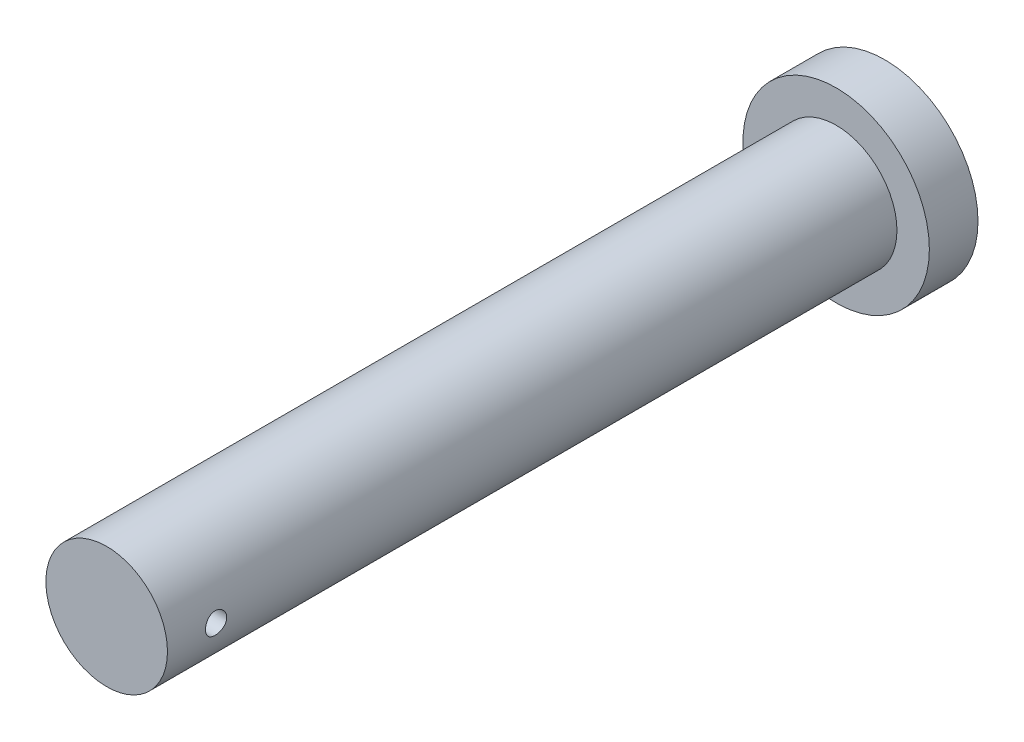
ISO-10303-21;
HEADER;
FILE_DESCRIPTION(('STEP AP214'),'2;1');
FILE_NAME('part.step','',(''),(''),'','','');
FILE_SCHEMA(('AUTOMOTIVE_DESIGN { 1 0 10303 214 1 1 1 1 }'));
ENDSEC;
DATA;
#1=APPLICATION_CONTEXT('core data for automotive mechanical design processes');
#2=APPLICATION_PROTOCOL_DEFINITION('international standard','automotive_design',2000,#1);
#3=PRODUCT_CONTEXT('',#1,'mechanical');
#4=PRODUCT('Part','Part','',(#3));
#5=PRODUCT_RELATED_PRODUCT_CATEGORY('part','',(#4));
#6=PRODUCT_DEFINITION_FORMATION('','',#4);
#7=PRODUCT_DEFINITION_CONTEXT('part definition',#1,'design');
#8=PRODUCT_DEFINITION('design','',#6,#7);
#9=PRODUCT_DEFINITION_SHAPE('','',#8);
#10=(LENGTH_UNIT() NAMED_UNIT(*) SI_UNIT(.MILLI.,.METRE.));
#11=(NAMED_UNIT(*) PLANE_ANGLE_UNIT() SI_UNIT($,.RADIAN.));
#12=(NAMED_UNIT(*) SI_UNIT($,.STERADIAN.) SOLID_ANGLE_UNIT());
#13=UNCERTAINTY_MEASURE_WITH_UNIT(LENGTH_MEASURE(1.E-05),#10,'distance_accuracy_value','');
#14=(GEOMETRIC_REPRESENTATION_CONTEXT(3) GLOBAL_UNCERTAINTY_ASSIGNED_CONTEXT((#13)) GLOBAL_UNIT_ASSIGNED_CONTEXT((#10,
#11,#12)) REPRESENTATION_CONTEXT('',''));
#15=CARTESIAN_POINT('',(0.,0.,0.));
#16=DIRECTION('',(0.,0.,1.));
#17=DIRECTION('',(1.,0.,0.));
#18=AXIS2_PLACEMENT_3D('',#15,#16,#17);
#19=CARTESIAN_POINT('',(0.00150887815658488,-3.10413833645559E-06,65.5854403164038));
#20=DIRECTION('',(0.,0.,-1.));
#21=DIRECTION('',(-1.,0.,0.));
#22=AXIS2_PLACEMENT_3D('',#19,#20,#21);
#23=CYLINDRICAL_SURFACE('',#22,6.9);
#24=CARTESIAN_POINT('',(0.00150887815658488,-3.10413833645559E-06,65.5854403164038));
#25=DIRECTION('',(0.,0.,1.));
#26=DIRECTION('',(1.,0.,0.));
#27=AXIS2_PLACEMENT_3D('',#24,#25,#26);
#28=CIRCLE('',#27,6.9);
#29=CARTESIAN_POINT('',(6.90150887815659,-3.10413833645559E-06,65.5854403164038));
#30=VERTEX_POINT('',#29);
#31=EDGE_CURVE('E49',#30,#30,#28,.T.);
#32=ORIENTED_EDGE('',*,*,#31,.F.);
#33=EDGE_LOOP('',(#32));
#34=FACE_BOUND('',#33,.T.);
#35=CARTESIAN_POINT('',(0.00150887815658488,-3.10413833645559E-06,61.9854403164038));
#36=DIRECTION('',(0.,0.,1.));
#37=DIRECTION('',(1.,0.,0.));
#38=AXIS2_PLACEMENT_3D('',#35,#36,#37);
#39=CIRCLE('',#38,6.9);
#40=CARTESIAN_POINT('',(6.90150887815659,-3.10413833645559E-06,61.9854403164038));
#41=VERTEX_POINT('',#40);
#42=EDGE_CURVE('E54',#41,#41,#39,.T.);
#43=ORIENTED_EDGE('',*,*,#42,.T.);
#44=EDGE_LOOP('',(#43));
#45=FACE_BOUND('',#44,.T.);
#46=ADVANCED_FACE('F37',(#34,#45),#23,.T.);
#47=CARTESIAN_POINT('',(0.00150887815658488,-3.10413833645559E-06,65.5854403164038));
#48=DIRECTION('',(0.,0.,1.));
#49=DIRECTION('',(1.,0.,0.));
#50=AXIS2_PLACEMENT_3D('',#47,#48,#49);
#51=PLANE('',#50);
#52=CARTESIAN_POINT('',(0.00150887815658488,-3.10413833645559E-06,65.5854403164038));
#53=DIRECTION('',(0.,0.,1.));
#54=DIRECTION('',(1.,0.,0.));
#55=AXIS2_PLACEMENT_3D('',#52,#53,#54);
#56=CIRCLE('',#55,4.5);
#57=CARTESIAN_POINT('',(4.50150887815658,-3.10413833645559E-06,65.5854403164038));
#58=VERTEX_POINT('',#57);
#59=EDGE_CURVE('E10',#58,#58,#56,.T.);
#60=ORIENTED_EDGE('',*,*,#59,.F.);
#61=EDGE_LOOP('',(#60));
#62=FACE_BOUND('',#61,.T.);
#63=ORIENTED_EDGE('',*,*,#31,.T.);
#64=EDGE_LOOP('',(#63));
#65=FACE_BOUND('',#64,.T.);
#66=ADVANCED_FACE('F84',(#62,#65),#51,.T.);
#67=CARTESIAN_POINT('',(0.00150887815658488,-3.10413833645559E-06,61.9854403164038));
#68=DIRECTION('',(0.,0.,1.));
#69=DIRECTION('',(1.,0.,0.));
#70=AXIS2_PLACEMENT_3D('',#67,#68,#69);
#71=PLANE('',#70);
#72=ORIENTED_EDGE('',*,*,#42,.F.);
#73=EDGE_LOOP('',(#72));
#74=FACE_BOUND('',#73,.T.);
#75=ADVANCED_FACE('F80',(#74),#71,.F.);
#76=CARTESIAN_POINT('',(0.00150887815658488,-3.10413833645559E-06,119.585440316404));
#77=DIRECTION('',(0.,0.,-1.));
#78=DIRECTION('',(-1.,0.,0.));
#79=AXIS2_PLACEMENT_3D('',#76,#77,#78);
#80=CYLINDRICAL_SURFACE('',#79,4.5);
#81=CARTESIAN_POINT('',(-4.45442158816483,-0.628241657005566,115.395025880592));
#82=CARTESIAN_POINT('',(-4.45908464189503,-0.595165315346732,115.359776064216));
#83=CARTESIAN_POINT('',(-4.46379194918088,-0.559105827558265,115.327298985479));
#84=CARTESIAN_POINT('',(-4.47277177238543,-0.48199739947078,115.268807039437));
#85=CARTESIAN_POINT('',(-4.47704393794455,-0.440944496108996,115.242797355525));
#86=CARTESIAN_POINT('',(-4.48467655891681,-0.35496877375173,115.198003782597));
#87=CARTESIAN_POINT('',(-4.48803674867462,-0.310044832146575,115.179221998379));
#88=CARTESIAN_POINT('',(-4.49346453944705,-0.217614236981534,115.149476428375));
#89=CARTESIAN_POINT('',(-4.49553248281439,-0.170108271101474,115.13851057182));
#90=CARTESIAN_POINT('',(-4.49812644371201,-0.0744567226821686,115.124821880962));
#91=CARTESIAN_POINT('',(-4.49867043436934,-0.0263253806830018,115.122002951125));
#92=CARTESIAN_POINT('',(-4.49820713375912,0.0697259588145206,115.124424770907));
#93=CARTESIAN_POINT('',(-4.49719988142046,0.11764596158623,115.12966531827));
#94=CARTESIAN_POINT('',(-4.49376330418042,0.211448089796457,115.147950666329));
#95=CARTESIAN_POINT('',(-4.49134740871731,0.257345115714608,115.160921792306));
#96=CARTESIAN_POINT('',(-4.48536713867426,0.346310629728414,115.194213013355));
#97=CARTESIAN_POINT('',(-4.48180269248939,0.389378941269913,115.214533566627));
#98=CARTESIAN_POINT('',(-4.47386562254401,0.471976629326449,115.262193965242));
#99=CARTESIAN_POINT('',(-4.46948474642374,0.511463129381743,115.289606707044));
#100=CARTESIAN_POINT('',(-4.46041663676609,0.58532401038841,115.350581966847));
#101=CARTESIAN_POINT('',(-4.45572937205555,0.619697869991027,115.384145111241));
#102=CARTESIAN_POINT('',(-4.44648959397433,0.682893027819792,115.457070761282));
#103=CARTESIAN_POINT('',(-4.44194018309145,0.71162266865462,115.496513167218));
#104=CARTESIAN_POINT('',(-4.43356913462012,0.762059352531074,115.579729728608));
#105=CARTESIAN_POINT('',(-4.429747480951,0.783766550749286,115.623503788317));
#106=CARTESIAN_POINT('',(-4.42328600293632,0.819460355985625,115.714027403764));
#107=CARTESIAN_POINT('',(-4.4206426774285,0.833469864369713,115.760767666792));
#108=CARTESIAN_POINT('',(-4.41683492356644,0.853426960621154,115.855995521083));
#109=CARTESIAN_POINT('',(-4.41567032086643,0.859375498906252,115.904482905661));
#110=CARTESIAN_POINT('',(-4.41496533847994,0.862990883092589,116.000993436611));
#111=CARTESIAN_POINT('',(-4.41539913384955,0.860789404185127,116.049011504811));
#112=CARTESIAN_POINT('',(-4.41778228458874,0.848468600640116,116.143980449925));
#113=CARTESIAN_POINT('',(-4.41973161856363,0.838349387776303,116.190931341895));
#114=CARTESIAN_POINT('',(-4.42491142848212,0.810552625549775,116.282292359247));
#115=CARTESIAN_POINT('',(-4.42813770282943,0.792899849580022,116.326710276078));
#116=CARTESIAN_POINT('',(-4.43550825189031,0.750555842276244,116.411971228863));
#117=CARTESIAN_POINT('',(-4.43965261299325,0.725863948518434,116.452813927895));
#118=CARTESIAN_POINT('',(-4.4484686690556,0.669710977314801,116.530415389091));
#119=CARTESIAN_POINT('',(-4.45314724446397,0.638155367797582,116.567104975998));
#120=CARTESIAN_POINT('',(-4.46246161292901,0.569356260556346,116.634704838051));
#121=CARTESIAN_POINT('',(-4.46709740309228,0.532112381103327,116.665614725022));
#122=CARTESIAN_POINT('',(-4.47585622782286,0.452562083955132,116.721061108423));
#123=CARTESIAN_POINT('',(-4.47997402982178,0.410211347111983,116.745534928458));
#124=CARTESIAN_POINT('',(-4.48718039076522,0.321910246171047,116.786997520259));
#125=CARTESIAN_POINT('',(-4.4902690315415,0.275960168626795,116.803986887171));
#126=CARTESIAN_POINT('',(-4.4950387824018,0.182295270646498,116.829808632498));
#127=CARTESIAN_POINT('',(-4.496734969236,0.134605355317505,116.838728494045));
#128=CARTESIAN_POINT('',(-4.49858461122729,0.0383773778960053,116.848442331254));
#129=CARTESIAN_POINT('',(-4.49873821993548,-0.0101605992970138,116.8492371157));
#130=CARTESIAN_POINT('',(-4.49749516906848,-0.105945974363043,116.842725930246));
#131=CARTESIAN_POINT('',(-4.49612135580411,-0.153201847020525,116.835539342917));
#132=CARTESIAN_POINT('',(-4.49201128783455,-0.245821260285907,116.813481955549));
#133=CARTESIAN_POINT('',(-4.48927500397496,-0.291184760377933,116.79861099108));
#134=CARTESIAN_POINT('',(-4.48272576808796,-0.37892774795275,116.761566468225));
#135=CARTESIAN_POINT('',(-4.47890904260237,-0.421296114985432,116.73936726991));
#136=CARTESIAN_POINT('',(-4.47061530139622,-0.501743106377016,116.688314927511));
#137=CARTESIAN_POINT('',(-4.46613821457594,-0.539821268038802,116.659461066745));
#138=CARTESIAN_POINT('',(-4.45692868485122,-0.611277092852366,116.595354060514));
#139=CARTESIAN_POINT('',(-4.45219323779277,-0.644566293622153,116.560002691459));
#140=CARTESIAN_POINT('',(-4.44306443475101,-0.70477100576878,116.4841937121));
#141=CARTESIAN_POINT('',(-4.43867109241654,-0.731686262933888,116.443735898235));
#142=CARTESIAN_POINT('',(-4.43070367936369,-0.778502340991595,116.358593233566));
#143=CARTESIAN_POINT('',(-4.42713396014198,-0.798366191047559,116.313887617274));
#144=CARTESIAN_POINT('',(-4.42126233378158,-0.830280344804465,116.221692378637));
#145=CARTESIAN_POINT('',(-4.41896026075986,-0.842331670881793,116.174203121457));
#146=CARTESIAN_POINT('',(-4.41592080244284,-0.858128725775877,116.078497367602));
#147=CARTESIAN_POINT('',(-4.41516198178782,-0.861988269649797,116.030300334047));
#148=CARTESIAN_POINT('',(-4.41523447229951,-0.861616903343752,115.933932407871));
#149=CARTESIAN_POINT('',(-4.41606592815913,-0.857385256978687,115.885761518028));
#150=CARTESIAN_POINT('',(-4.4192039151499,-0.841053270783057,115.791341200307));
#151=CARTESIAN_POINT('',(-4.42149518103701,-0.829034340842851,115.74507710194));
#152=CARTESIAN_POINT('',(-4.42727572189041,-0.797574937485786,115.655253002983));
#153=CARTESIAN_POINT('',(-4.43076415895816,-0.77813965370331,115.611691136216));
#154=CARTESIAN_POINT('',(-4.43761864379032,-0.737875855648044,115.538353832983));
#155=CARTESIAN_POINT('',(-4.44081615305879,-0.718480293865849,115.507765052304));
#156=CARTESIAN_POINT('',(-4.44747472263381,-0.676026115854927,115.449276277778));
#157=CARTESIAN_POINT('',(-4.45093579075518,-0.652967390987133,115.421376363715));
#158=CARTESIAN_POINT('',(-4.45442158816483,-0.628241657005566,115.395025880592));
#159=B_SPLINE_CURVE_WITH_KNOTS('',3,(#81,#82,#83,#84,#85,#86,#87,#88,#89,#90,#91,#92,#93,#94,
#95,#96,#97,#98,#99,#100,#101,#102,#103,#104,#105,#106,#107,#108,#109,#110,#111,#112,#113,#114,
#115,#116,#117,#118,#119,#120,#121,#122,#123,#124,#125,#126,#127,#128,#129,#130,#131,#132,#133,
#134,#135,#136,#137,#138,#139,#140,#141,#142,#143,#144,#145,#146,#147,#148,#149,#150,#151,#152,
#153,#154,#155,#156,#157,#158),.UNSPECIFIED.,.T.,.F.,(4,2,2,2,2,2,2,2,2,2,2,2,2,2,2,2,2,2,2,2,2,
2,2,2,2,2,2,2,2,2,2,2,2,2,2,2,2,2,4),(0.,0.145558785347662,0.291233857721286,0.43695131929201,
0.582630159788627,0.726583516748452,0.87053326121633,1.01313257974879,1.1557407901737,
1.29987743254881,1.44402876283644,1.59035625613242,1.73668051577403,1.88256705648098,
2.02843639513623,2.1719593674564,2.31548031371586,2.4585328984207,2.60159894969004,
2.74677661411593,2.89196402542369,3.03851693587958,3.18505819068549,3.32999103167032,
3.47490944562834,3.61768906857624,3.76047174688194,3.90375938199778,4.04706245587112,
4.19274295012531,4.33842925357055,4.48486849122596,4.63128856141931,4.7756606110284,
4.92004579709903,5.06294538717913,5.20574516531132,5.31455227245615,5.42336260711494),.UNSPECIFIED.);
#160=CARTESIAN_POINT('',(-4.45442158816483,-0.628241657005566,115.395025880592));
#161=VERTEX_POINT('',#160);
#162=EDGE_CURVE('E40',#161,#161,#159,.T.);
#163=ORIENTED_EDGE('',*,*,#162,.T.);
#164=EDGE_LOOP('',(#163));
#165=FACE_BOUND('',#164,.T.);
#166=CARTESIAN_POINT('',(4.46444197492785,-0.576395482422125,115.448397790364));
#167=CARTESIAN_POINT('',(4.46055798272289,-0.606469289280741,115.480629849174));
#168=CARTESIAN_POINT('',(4.45671233434578,-0.633849980107744,115.51541036256));
#169=CARTESIAN_POINT('',(4.44952923254881,-0.682441072593587,115.589121473744));
#170=CARTESIAN_POINT('',(4.44619219985556,-0.703646379039725,115.628055462528));
#171=CARTESIAN_POINT('',(4.4404089830628,-0.739254663704348,115.708998401682));
#172=CARTESIAN_POINT('',(4.43796301547893,-0.753655988908061,115.751008096429));
#173=CARTESIAN_POINT('',(4.43424949269427,-0.775200916688463,115.836890328651));
#174=CARTESIAN_POINT('',(4.43298163531381,-0.782346380402788,115.880762385419));
#175=CARTESIAN_POINT('',(4.43177991278121,-0.789123148021641,115.968632421126));
#176=CARTESIAN_POINT('',(4.43183204905147,-0.78883330319131,116.012624135249));
#177=CARTESIAN_POINT('',(4.43322963105409,-0.78094279241096,116.09992572324));
#178=CARTESIAN_POINT('',(4.43457508380566,-0.773342086782759,116.143235593407));
#179=CARTESIAN_POINT('',(4.43839338698654,-0.751122825609791,116.227727122503));
#180=CARTESIAN_POINT('',(4.44086054472197,-0.736539686558787,116.268918372515));
#181=CARTESIAN_POINT('',(4.44664186105572,-0.700801734909449,116.3482792797));
#182=CARTESIAN_POINT('',(4.44995608115198,-0.679646445139537,116.386448717222));
#183=CARTESIAN_POINT('',(4.45710793315115,-0.631069598484353,116.459180120749));
#184=CARTESIAN_POINT('',(4.46095135219232,-0.603576107510073,116.493693469319));
#185=CARTESIAN_POINT('',(4.468703978435,-0.543226341348336,116.557654432799));
#186=CARTESIAN_POINT('',(4.47261319027357,-0.510369686734042,116.587101688997));
#187=CARTESIAN_POINT('',(4.48010755215905,-0.43980311479993,116.640412993255));
#188=CARTESIAN_POINT('',(4.48368877074127,-0.402044862126316,116.664213679119));
#189=CARTESIAN_POINT('',(4.49007654544238,-0.323004943332602,116.705132083102));
#190=CARTESIAN_POINT('',(4.4928831359819,-0.28172343387537,116.722250098181));
#191=CARTESIAN_POINT('',(4.49739020556611,-0.197069919690625,116.749204590981));
#192=CARTESIAN_POINT('',(4.49909739655498,-0.153712370497566,116.759085305059));
#193=CARTESIAN_POINT('',(4.50124009342546,-0.065924460503872,116.771429178084));
#194=CARTESIAN_POINT('',(4.50167570826797,-0.0214941919531531,116.773892972583));
#195=CARTESIAN_POINT('',(4.50122906294843,0.0665879455891598,116.771342848228));
#196=CARTESIAN_POINT('',(4.50036314985581,0.110242617083275,116.766421684997));
#197=CARTESIAN_POINT('',(4.49743945963356,0.196093214222254,116.749423819347));
#198=CARTESIAN_POINT('',(4.49538167391135,0.238289129348186,116.737347065341));
#199=CARTESIAN_POINT('',(4.49029802170678,0.320081316779191,116.706386465268));
#200=CARTESIAN_POINT('',(4.48727132352827,0.359675320330906,116.687496769329));
#201=CARTESIAN_POINT('',(4.4805799469197,0.435151827928461,116.643453031401));
#202=CARTESIAN_POINT('',(4.47691521444587,0.471034017159638,116.618298458677));
#203=CARTESIAN_POINT('',(4.46929595000845,0.538559646622187,116.562055120017));
#204=CARTESIAN_POINT('',(4.46533830134546,0.5701427492098,116.530894309886));
#205=CARTESIAN_POINT('',(4.45761632783665,0.6276516040389,116.463705482189));
#206=CARTESIAN_POINT('',(4.45385201035344,0.653577140946084,116.427677279447));
#207=CARTESIAN_POINT('',(4.4469248476595,0.699148331837597,116.351551416803));
#208=CARTESIAN_POINT('',(4.44376499774718,0.718763024909315,116.311434928094));
#209=CARTESIAN_POINT('',(4.43843747325842,0.750951422398526,116.228408453492));
#210=CARTESIAN_POINT('',(4.4362697111844,0.76352574776585,116.185498714332));
#211=CARTESIAN_POINT('',(4.43320164257585,0.781136485646538,116.098641413433));
#212=CARTESIAN_POINT('',(4.43228672525806,0.78625983658351,116.054711999725));
#213=CARTESIAN_POINT('',(4.43178461287112,0.789084527502659,115.966609275161));
#214=CARTESIAN_POINT('',(4.43219732421916,0.786786390615757,115.922435981716));
#215=CARTESIAN_POINT('',(4.43428997445006,0.774907660004727,115.835600249067));
#216=CARTESIAN_POINT('',(4.4359561901112,0.765405921816029,115.792926649801));
#217=CARTESIAN_POINT('',(4.44034894928304,0.739503488871407,115.709785956524));
#218=CARTESIAN_POINT('',(4.44307553980809,0.723102488216929,115.66931896044));
#219=CARTESIAN_POINT('',(4.44930446988812,0.683745496763695,115.591426854467));
#220=CARTESIAN_POINT('',(4.45281198105495,0.660745496712455,115.554024410536));
#221=CARTESIAN_POINT('',(4.46020177267928,0.608882622961929,115.483573392166));
#222=CARTESIAN_POINT('',(4.46408408734744,0.580019213806796,115.45052521582));
#223=CARTESIAN_POINT('',(4.47185240519523,0.516771270207459,115.389239340863));
#224=CARTESIAN_POINT('',(4.47573770326425,0.482315285327062,115.361075237581));
#225=CARTESIAN_POINT('',(4.48302256319301,0.409124574623452,115.310917100348));
#226=CARTESIAN_POINT('',(4.4864221239762,0.37038983931758,115.288923080072));
#227=CARTESIAN_POINT('',(4.49235550504969,0.289705994981122,115.251738465486));
#228=CARTESIAN_POINT('',(4.49488912158999,0.24775613229453,115.236549472085));
#229=CARTESIAN_POINT('',(4.49880260986531,0.16184902822508,115.21344709517));
#230=CARTESIAN_POINT('',(4.50018261684261,0.117892022785016,115.205532858797));
#231=CARTESIAN_POINT('',(4.50162279921178,0.0298210150187889,115.197280119794));
#232=CARTESIAN_POINT('',(4.50169966039498,-0.0142837578061387,115.196845840848));
#233=CARTESIAN_POINT('',(4.50056769376764,-0.101940674708124,115.203322207682));
#234=CARTESIAN_POINT('',(4.49935868933836,-0.145492742037319,115.210233862455));
#235=CARTESIAN_POINT('',(4.49579873438416,-0.230577593351031,115.231134707755));
#236=CARTESIAN_POINT('',(4.49345352017816,-0.272119379959288,115.245088360333));
#237=CARTESIAN_POINT('',(4.48788090487794,-0.352250342640683,115.279637223727));
#238=CARTESIAN_POINT('',(4.48465417501667,-0.390841736799232,115.300227383289));
#239=CARTESIAN_POINT('',(4.47855997260749,-0.454720898245905,115.341433227442));
#240=CARTESIAN_POINT('',(4.47580996869601,-0.480895340842152,115.36070957608));
#241=CARTESIAN_POINT('',(4.47018037887253,-0.530664737882533,115.402329609142));
#242=CARTESIAN_POINT('',(4.46730079012017,-0.554259635746529,115.424673360823));
#243=CARTESIAN_POINT('',(4.46444197492785,-0.576395482422125,115.448397790364));
#244=B_SPLINE_CURVE_WITH_KNOTS('',3,(#166,#167,#168,#169,#170,#171,#172,#173,#174,#175,#176,
#177,#178,#179,#180,#181,#182,#183,#184,#185,#186,#187,#188,#189,#190,#191,#192,#193,#194,#195,
#196,#197,#198,#199,#200,#201,#202,#203,#204,#205,#206,#207,#208,#209,#210,#211,#212,#213,#214,
#215,#216,#217,#218,#219,#220,#221,#222,#223,#224,#225,#226,#227,#228,#229,#230,#231,#232,#233,
#234,#235,#236,#237,#238,#239,#240,#241,#242,#243),.UNSPECIFIED.,.T.,.F.,(4,2,2,2,2,2,2,2,2,2,2,
2,2,2,2,2,2,2,2,2,2,2,2,2,2,2,2,2,2,2,2,2,2,2,2,2,2,2,4),(0.,0.132646191505583,
0.265401519219314,0.398189083032546,0.530942578057849,0.662288813274068,0.793635761348772,
0.924323433905369,1.05502059727031,1.1872812531419,1.31955127009461,1.45324190684896,
1.5869266020956,1.7197872013693,1.85263641553229,1.98383094070264,2.11502641170521,
2.24633480175903,2.37765431951708,2.51065988745224,2.64367051686957,2.77732408182922,
2.91096585688798,3.04303542214399,3.17509567819317,3.30573081914548,3.43637175279137,
3.56790504157056,3.69945034758312,3.83283203930554,3.96621402663727,4.09962737615096,
4.23302508288767,4.36471342470065,4.49641985676777,4.62746817171754,4.75841697630348,
4.85604915774116,4.95368348022894),.UNSPECIFIED.);
#245=CARTESIAN_POINT('',(4.46444197492785,-0.576395482422125,115.448397790364));
#246=VERTEX_POINT('',#245);
#247=EDGE_CURVE('E60',#246,#246,#244,.T.);
#248=ORIENTED_EDGE('',*,*,#247,.T.);
#249=EDGE_LOOP('',(#248));
#250=FACE_BOUND('',#249,.T.);
#251=CARTESIAN_POINT('',(0.00150887815658488,-3.10413833645559E-06,119.585440316404));
#252=DIRECTION('',(0.,0.,1.));
#253=DIRECTION('',(1.,0.,0.));
#254=AXIS2_PLACEMENT_3D('',#251,#252,#253);
#255=CIRCLE('',#254,4.5);
#256=CARTESIAN_POINT('',(4.50150887815658,-3.10413833645559E-06,119.585440316404));
#257=VERTEX_POINT('',#256);
#258=EDGE_CURVE('E57',#257,#257,#255,.T.);
#259=ORIENTED_EDGE('',*,*,#258,.F.);
#260=EDGE_LOOP('',(#259));
#261=FACE_BOUND('',#260,.T.);
#262=ORIENTED_EDGE('',*,*,#59,.T.);
#263=EDGE_LOOP('',(#262));
#264=FACE_BOUND('',#263,.T.);
#265=ADVANCED_FACE('F65',(#165,#250,#261,#264),#80,.T.);
#266=CARTESIAN_POINT('',(0.00150887815658488,-3.10413833645559E-06,119.585440316404));
#267=DIRECTION('',(0.,0.,1.));
#268=DIRECTION('',(1.,0.,0.));
#269=AXIS2_PLACEMENT_3D('',#266,#267,#268);
#270=PLANE('',#269);
#271=ORIENTED_EDGE('',*,*,#258,.T.);
#272=EDGE_LOOP('',(#271));
#273=FACE_BOUND('',#272,.T.);
#274=ADVANCED_FACE('F72',(#273),#270,.T.);
#275=CARTESIAN_POINT('',(9.00150887815658,-3.10413833425123E-06,115.985440316404));
#276=DIRECTION('',(-1.,0.,0.));
#277=DIRECTION('',(0.,-1.,0.));
#278=AXIS2_PLACEMENT_3D('',#275,#276,#277);
#279=CONICAL_SURFACE('',#278,0.75,0.00833314044013592);
#280=ORIENTED_EDGE('',*,*,#247,.F.);
#281=EDGE_LOOP('',(#280));
#282=FACE_BOUND('',#281,.T.);
#283=ORIENTED_EDGE('',*,*,#162,.F.);
#284=EDGE_LOOP('',(#283));
#285=FACE_BOUND('',#284,.T.);
#286=ADVANCED_FACE('F69',(#282,#285),#279,.F.);
#287=CLOSED_SHELL('',(#46,#66,#75,#265,#274,#286));
#288=MANIFOLD_SOLID_BREP('B2',#287);
#289=ADVANCED_BREP_SHAPE_REPRESENTATION('',(#18,#288),#14);
#290=SHAPE_DEFINITION_REPRESENTATION(#9,#289);
ENDSEC;
END-ISO-10303-21;
